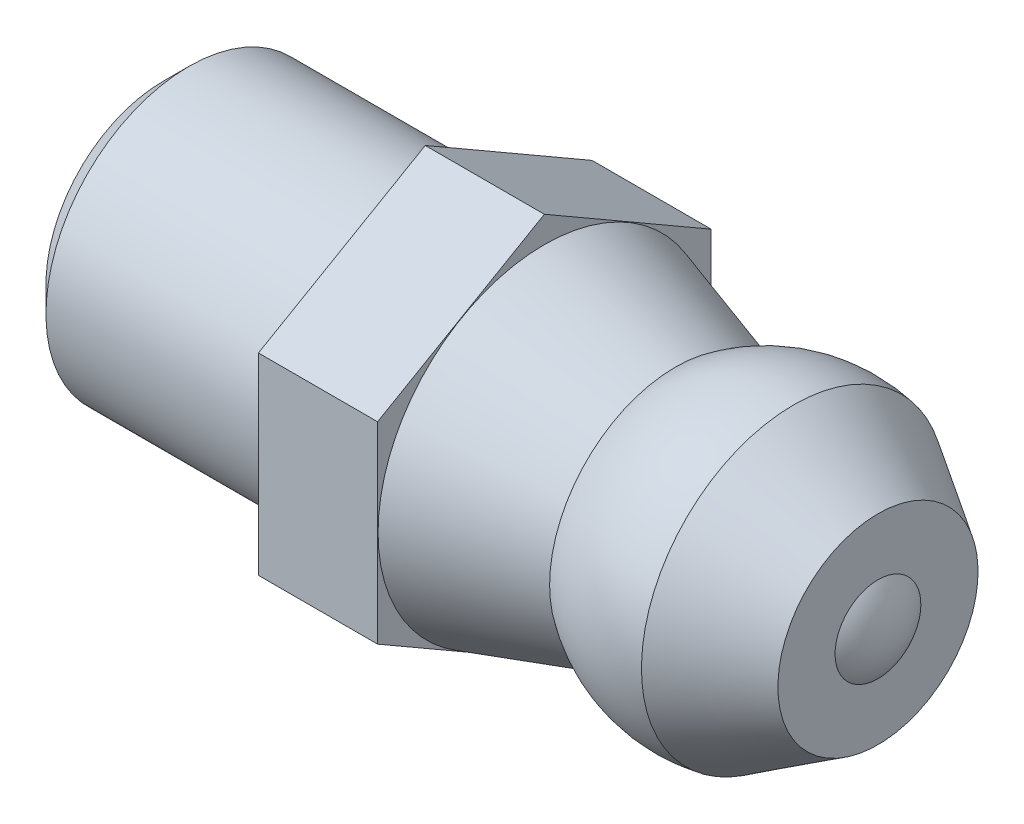
ISO-10303-21;
HEADER;
FILE_DESCRIPTION(('STEP AP214'),'2;1');
FILE_NAME('part.step','',(''),(''),'','','');
FILE_SCHEMA(('AUTOMOTIVE_DESIGN { 1 0 10303 214 1 1 1 1 }'));
ENDSEC;
DATA;
#1=APPLICATION_CONTEXT('core data for automotive mechanical design processes');
#2=APPLICATION_PROTOCOL_DEFINITION('international standard','automotive_design',2000,#1);
#3=PRODUCT_CONTEXT('',#1,'mechanical');
#4=PRODUCT('Part','Part','',(#3));
#5=PRODUCT_RELATED_PRODUCT_CATEGORY('part','',(#4));
#6=PRODUCT_DEFINITION_FORMATION('','',#4);
#7=PRODUCT_DEFINITION_CONTEXT('part definition',#1,'design');
#8=PRODUCT_DEFINITION('design','',#6,#7);
#9=PRODUCT_DEFINITION_SHAPE('','',#8);
#10=(LENGTH_UNIT() NAMED_UNIT(*) SI_UNIT(.MILLI.,.METRE.));
#11=(NAMED_UNIT(*) PLANE_ANGLE_UNIT() SI_UNIT($,.RADIAN.));
#12=(NAMED_UNIT(*) SI_UNIT($,.STERADIAN.) SOLID_ANGLE_UNIT());
#13=UNCERTAINTY_MEASURE_WITH_UNIT(LENGTH_MEASURE(1.E-05),#10,'distance_accuracy_value','');
#14=(GEOMETRIC_REPRESENTATION_CONTEXT(3) GLOBAL_UNCERTAINTY_ASSIGNED_CONTEXT((#13)) GLOBAL_UNIT_ASSIGNED_CONTEXT((#10,
#11,#12)) REPRESENTATION_CONTEXT('',''));
#15=CARTESIAN_POINT('',(0.,0.,0.));
#16=DIRECTION('',(0.,0.,1.));
#17=DIRECTION('',(1.,0.,0.));
#18=AXIS2_PLACEMENT_3D('',#15,#16,#17);
#19=CARTESIAN_POINT('',(8.3,0.,0.));
#20=DIRECTION('',(0.,0.,1.));
#21=DIRECTION('',(1.,0.,0.));
#22=AXIS2_PLACEMENT_3D('',#19,#20,#21);
#23=SPHERICAL_SURFACE('',#22,1.5);
#24=CARTESIAN_POINT('',(8.3,0.,0.));
#25=DIRECTION('',(1.,0.,0.));
#26=DIRECTION('',(0.,1.,0.));
#27=AXIS2_PLACEMENT_3D('',#24,#25,#26);
#28=SPHERICAL_SURFACE('',#27,1.5);
#29=CARTESIAN_POINT('',(9.5,0.,0.));
#30=DIRECTION('',(1.,0.,0.));
#31=DIRECTION('',(0.,1.,0.));
#32=AXIS2_PLACEMENT_3D('',#29,#30,#31);
#33=CIRCLE('',#32,0.9);
#34=CARTESIAN_POINT('',(9.5,0.9,0.));
#35=VERTEX_POINT('',#34);
#36=EDGE_CURVE('E11',#35,#35,#33,.T.);
#37=ORIENTED_EDGE('',*,*,#36,.T.);
#38=EDGE_LOOP('',(#37));
#39=FACE_BOUND('',#38,.T.);
#40=ADVANCED_FACE('F16',(#39),#28,.T.);
#41=CARTESIAN_POINT('',(9.5,1.5,0.));
#42=DIRECTION('',(1.,0.,0.));
#43=DIRECTION('',(0.,1.,0.));
#44=AXIS2_PLACEMENT_3D('',#41,#42,#43);
#45=PLANE('',#44);
#46=CARTESIAN_POINT('',(9.5,0.,0.));
#47=DIRECTION('',(1.,0.,0.));
#48=DIRECTION('',(0.,1.,0.));
#49=AXIS2_PLACEMENT_3D('',#46,#47,#48);
#50=CIRCLE('',#49,2.1);
#51=CARTESIAN_POINT('',(9.5,2.1,0.));
#52=VERTEX_POINT('',#51);
#53=EDGE_CURVE('E26',#52,#52,#50,.T.);
#54=ORIENTED_EDGE('',*,*,#53,.T.);
#55=EDGE_LOOP('',(#54));
#56=FACE_BOUND('',#55,.T.);
#57=ORIENTED_EDGE('',*,*,#36,.F.);
#58=EDGE_LOOP('',(#57));
#59=FACE_BOUND('',#58,.T.);
#60=ADVANCED_FACE('F153',(#56,#59),#45,.T.);
#61=CARTESIAN_POINT('',(8.615744386,0.,0.));
#62=DIRECTION('',(-1.,0.,0.));
#63=DIRECTION('',(0.,1.,0.));
#64=AXIS2_PLACEMENT_3D('',#61,#62,#63);
#65=CONICAL_SURFACE('',#64,2.6470676255,0.554038706826686);
#66=CARTESIAN_POINT('',(7.731488772,0.,0.));
#67=DIRECTION('',(1.,0.,0.));
#68=DIRECTION('',(0.,1.,0.));
#69=AXIS2_PLACEMENT_3D('',#66,#67,#68);
#70=CIRCLE('',#69,3.194135251);
#71=CARTESIAN_POINT('',(7.731488772,3.194135251,0.));
#72=VERTEX_POINT('',#71);
#73=EDGE_CURVE('E95',#72,#72,#70,.T.);
#74=ORIENTED_EDGE('',*,*,#73,.T.);
#75=EDGE_LOOP('',(#74));
#76=FACE_BOUND('',#75,.T.);
#77=ORIENTED_EDGE('',*,*,#53,.F.);
#78=EDGE_LOOP('',(#77));
#79=FACE_BOUND('',#78,.T.);
#80=ADVANCED_FACE('F156',(#76,#79),#65,.T.);
#81=CARTESIAN_POINT('',(7.14260971425139,0.,0.));
#82=DIRECTION('',(1.,0.,0.));
#83=DIRECTION('',(0.,0.,1.));
#84=AXIS2_PLACEMENT_3D('',#81,#82,#83);
#85=DEGENERATE_TOROIDAL_SURFACE('',#84,0.00206897516345217,3.25,.F.);
#86=CARTESIAN_POINT('',(5.25,0.,0.));
#87=DIRECTION('',(1.,0.,0.));
#88=DIRECTION('',(0.,1.,0.));
#89=AXIS2_PLACEMENT_3D('',#86,#87,#88);
#90=CIRCLE('',#89,2.64);
#91=CARTESIAN_POINT('',(5.25,2.64,0.));
#92=VERTEX_POINT('',#91);
#93=EDGE_CURVE('E91',#92,#92,#90,.T.);
#94=ORIENTED_EDGE('',*,*,#93,.T.);
#95=EDGE_LOOP('',(#94));
#96=FACE_BOUND('',#95,.T.);
#97=ORIENTED_EDGE('',*,*,#73,.F.);
#98=EDGE_LOOP('',(#97));
#99=FACE_BOUND('',#98,.T.);
#100=ADVANCED_FACE('F92',(#96,#99),#85,.F.);
#101=CARTESIAN_POINT('',(3.875,0.,0.));
#102=DIRECTION('',(-1.,0.,0.));
#103=DIRECTION('',(0.,1.,0.));
#104=AXIS2_PLACEMENT_3D('',#101,#102,#103);
#105=CONICAL_SURFACE('',#104,3.065,0.29977607009998);
#106=CARTESIAN_POINT('',(2.5,0.,0.));
#107=DIRECTION('',(1.,0.,0.));
#108=DIRECTION('',(0.,1.,0.));
#109=AXIS2_PLACEMENT_3D('',#106,#107,#108);
#110=CIRCLE('',#109,3.49);
#111=CARTESIAN_POINT('',(2.5,3.49,0.));
#112=VERTEX_POINT('',#111);
#113=EDGE_CURVE('E96',#112,#112,#110,.T.);
#114=ORIENTED_EDGE('',*,*,#113,.T.);
#115=EDGE_LOOP('',(#114));
#116=FACE_BOUND('',#115,.T.);
#117=ORIENTED_EDGE('',*,*,#93,.F.);
#118=EDGE_LOOP('',(#117));
#119=FACE_BOUND('',#118,.T.);
#120=ADVANCED_FACE('F164',(#116,#119),#105,.T.);
#121=CARTESIAN_POINT('',(2.5,3.495,0.));
#122=DIRECTION('',(1.,0.,0.));
#123=DIRECTION('',(0.,1.,0.));
#124=AXIS2_PLACEMENT_3D('',#121,#122,#123);
#125=PLANE('',#124);
#126=DIRECTION('',(0.,0.5,-0.866025403784439));
#127=VECTOR('',#126,1.);
#128=CARTESIAN_POINT('',(2.5,4.04145188432738,0.));
#129=LINE('',#128,#127);
#130=CARTESIAN_POINT('',(2.5,2.02072594216369,3.5));
#131=VERTEX_POINT('',#130);
#132=CARTESIAN_POINT('',(2.5,4.04145188432738,0.));
#133=VERTEX_POINT('',#132);
#134=EDGE_CURVE('E102',#131,#133,#129,.T.);
#135=ORIENTED_EDGE('',*,*,#134,.F.);
#136=DIRECTION('',(0.,1.,0.));
#137=VECTOR('',#136,1.);
#138=CARTESIAN_POINT('',(2.5,2.02072594216369,3.5));
#139=LINE('',#138,#137);
#140=CARTESIAN_POINT('',(2.5,-2.02072594216369,3.5));
#141=VERTEX_POINT('',#140);
#142=EDGE_CURVE('E130',#141,#131,#139,.T.);
#143=ORIENTED_EDGE('',*,*,#142,.F.);
#144=DIRECTION('',(0.,0.5,0.866025403784439));
#145=VECTOR('',#144,1.);
#146=CARTESIAN_POINT('',(2.5,-2.02072594216369,3.5));
#147=LINE('',#146,#145);
#148=CARTESIAN_POINT('',(2.5,-4.04145188432738,0.));
#149=VERTEX_POINT('',#148);
#150=EDGE_CURVE('E122',#149,#141,#147,.T.);
#151=ORIENTED_EDGE('',*,*,#150,.F.);
#152=DIRECTION('',(0.,-0.5,0.866025403784439));
#153=VECTOR('',#152,1.);
#154=CARTESIAN_POINT('',(2.5,-4.04145188432738,0.));
#155=LINE('',#154,#153);
#156=CARTESIAN_POINT('',(2.5,-2.02072594216369,-3.5));
#157=VERTEX_POINT('',#156);
#158=EDGE_CURVE('E137',#157,#149,#155,.T.);
#159=ORIENTED_EDGE('',*,*,#158,.F.);
#160=DIRECTION('',(0.,-1.,0.));
#161=VECTOR('',#160,1.);
#162=CARTESIAN_POINT('',(2.5,-2.02072594216369,-3.5));
#163=LINE('',#162,#161);
#164=CARTESIAN_POINT('',(2.5,2.02072594216369,-3.5));
#165=VERTEX_POINT('',#164);
#166=EDGE_CURVE('E106',#165,#157,#163,.T.);
#167=ORIENTED_EDGE('',*,*,#166,.F.);
#168=DIRECTION('',(0.,-0.5,-0.866025403784439));
#169=VECTOR('',#168,1.);
#170=CARTESIAN_POINT('',(2.5,2.02072594216369,-3.5));
#171=LINE('',#170,#169);
#172=EDGE_CURVE('E114',#133,#165,#171,.T.);
#173=ORIENTED_EDGE('',*,*,#172,.F.);
#174=EDGE_LOOP('',(#135,#143,#151,#159,#167,#173));
#175=FACE_BOUND('',#174,.T.);
#176=ORIENTED_EDGE('',*,*,#113,.F.);
#177=EDGE_LOOP('',(#176));
#178=FACE_BOUND('',#177,.T.);
#179=ADVANCED_FACE('F202',(#175,#178),#125,.T.);
#180=CARTESIAN_POINT('',(0.,3.25,0.));
#181=DIRECTION('',(-1.,0.,0.));
#182=DIRECTION('',(0.,-1.,0.));
#183=AXIS2_PLACEMENT_3D('',#180,#181,#182);
#184=PLANE('',#183);
#185=CARTESIAN_POINT('',(0.,0.,0.));
#186=DIRECTION('',(1.,0.,0.));
#187=DIRECTION('',(0.,1.,0.));
#188=AXIS2_PLACEMENT_3D('',#185,#186,#187);
#189=CIRCLE('',#188,3.);
#190=CARTESIAN_POINT('',(0.,3.,0.));
#191=VERTEX_POINT('',#190);
#192=EDGE_CURVE('E43',#191,#191,#189,.T.);
#193=ORIENTED_EDGE('',*,*,#192,.T.);
#194=EDGE_LOOP('',(#193));
#195=FACE_BOUND('',#194,.T.);
#196=DIRECTION('',(0.,-0.5,0.866025403784439));
#197=VECTOR('',#196,1.);
#198=CARTESIAN_POINT('',(0.,4.04145188432738,0.));
#199=LINE('',#198,#197);
#200=CARTESIAN_POINT('',(0.,4.04145188432738,0.));
#201=VERTEX_POINT('',#200);
#202=CARTESIAN_POINT('',(0.,2.02072594216369,3.5));
#203=VERTEX_POINT('',#202);
#204=EDGE_CURVE('E118',#201,#203,#199,.T.);
#205=ORIENTED_EDGE('',*,*,#204,.F.);
#206=DIRECTION('',(0.,0.5,0.866025403784439));
#207=VECTOR('',#206,1.);
#208=CARTESIAN_POINT('',(0.,2.02072594216369,-3.5));
#209=LINE('',#208,#207);
#210=CARTESIAN_POINT('',(0.,2.02072594216369,-3.5));
#211=VERTEX_POINT('',#210);
#212=EDGE_CURVE('E120',#211,#201,#209,.T.);
#213=ORIENTED_EDGE('',*,*,#212,.F.);
#214=DIRECTION('',(0.,1.,0.));
#215=VECTOR('',#214,1.);
#216=CARTESIAN_POINT('',(0.,-2.02072594216369,-3.5));
#217=LINE('',#216,#215);
#218=CARTESIAN_POINT('',(0.,-2.02072594216369,-3.5));
#219=VERTEX_POINT('',#218);
#220=EDGE_CURVE('E110',#219,#211,#217,.T.);
#221=ORIENTED_EDGE('',*,*,#220,.F.);
#222=DIRECTION('',(0.,0.5,-0.866025403784439));
#223=VECTOR('',#222,1.);
#224=CARTESIAN_POINT('',(0.,-4.04145188432738,0.));
#225=LINE('',#224,#223);
#226=CARTESIAN_POINT('',(0.,-4.04145188432738,0.));
#227=VERTEX_POINT('',#226);
#228=EDGE_CURVE('E20',#227,#219,#225,.T.);
#229=ORIENTED_EDGE('',*,*,#228,.F.);
#230=DIRECTION('',(0.,-0.5,-0.866025403784439));
#231=VECTOR('',#230,1.);
#232=CARTESIAN_POINT('',(0.,-2.02072594216369,3.5));
#233=LINE('',#232,#231);
#234=CARTESIAN_POINT('',(0.,-2.02072594216369,3.5));
#235=VERTEX_POINT('',#234);
#236=EDGE_CURVE('E139',#235,#227,#233,.T.);
#237=ORIENTED_EDGE('',*,*,#236,.F.);
#238=DIRECTION('',(0.,-1.,0.));
#239=VECTOR('',#238,1.);
#240=CARTESIAN_POINT('',(0.,2.02072594216369,3.5));
#241=LINE('',#240,#239);
#242=EDGE_CURVE('E131',#203,#235,#241,.T.);
#243=ORIENTED_EDGE('',*,*,#242,.F.);
#244=EDGE_LOOP('',(#205,#213,#221,#229,#237,#243));
#245=FACE_BOUND('',#244,.T.);
#246=ADVANCED_FACE('F18',(#195,#245),#184,.T.);
#247=CARTESIAN_POINT('',(-2.479367,0.,0.));
#248=DIRECTION('',(-1.,0.,0.));
#249=DIRECTION('',(0.,1.,0.));
#250=AXIS2_PLACEMENT_3D('',#247,#248,#249);
#251=CYLINDRICAL_SURFACE('',#250,3.);
#252=CARTESIAN_POINT('',(-4.958734,0.,0.));
#253=DIRECTION('',(1.,0.,0.));
#254=DIRECTION('',(0.,1.,0.));
#255=AXIS2_PLACEMENT_3D('',#252,#253,#254);
#256=CIRCLE('',#255,3.);
#257=CARTESIAN_POINT('',(-4.958734,3.,0.));
#258=VERTEX_POINT('',#257);
#259=EDGE_CURVE('E52',#258,#258,#256,.T.);
#260=ORIENTED_EDGE('',*,*,#259,.T.);
#261=EDGE_LOOP('',(#260));
#262=FACE_BOUND('',#261,.T.);
#263=ORIENTED_EDGE('',*,*,#192,.F.);
#264=EDGE_LOOP('',(#263));
#265=FACE_BOUND('',#264,.T.);
#266=ADVANCED_FACE('F222',(#262,#265),#251,.T.);
#267=CARTESIAN_POINT('',(-5.229367,0.,0.));
#268=DIRECTION('',(1.,0.,0.));
#269=DIRECTION('',(0.,1.,0.));
#270=AXIS2_PLACEMENT_3D('',#267,#268,#269);
#271=CONICAL_SURFACE('',#270,2.729367,0.785398163397448);
#272=CARTESIAN_POINT('',(-5.5,0.,0.));
#273=DIRECTION('',(1.,0.,0.));
#274=DIRECTION('',(0.,1.,0.));
#275=AXIS2_PLACEMENT_3D('',#272,#273,#274);
#276=CIRCLE('',#275,2.458734);
#277=CARTESIAN_POINT('',(-5.5,2.458734,0.));
#278=VERTEX_POINT('',#277);
#279=EDGE_CURVE('E105',#278,#278,#276,.T.);
#280=ORIENTED_EDGE('',*,*,#279,.T.);
#281=EDGE_LOOP('',(#280));
#282=FACE_BOUND('',#281,.T.);
#283=ORIENTED_EDGE('',*,*,#259,.F.);
#284=EDGE_LOOP('',(#283));
#285=FACE_BOUND('',#284,.T.);
#286=ADVANCED_FACE('F214',(#282,#285),#271,.T.);
#287=CARTESIAN_POINT('',(-5.5,1.229367,0.));
#288=DIRECTION('',(-1.,0.,0.));
#289=DIRECTION('',(0.,-1.,0.));
#290=AXIS2_PLACEMENT_3D('',#287,#288,#289);
#291=PLANE('',#290);
#292=ORIENTED_EDGE('',*,*,#279,.F.);
#293=EDGE_LOOP('',(#292));
#294=FACE_BOUND('',#293,.T.);
#295=ADVANCED_FACE('F209',(#294),#291,.T.);
#296=CARTESIAN_POINT('',(0.,-3.03108891324554,-1.75));
#297=DIRECTION('',(0.,-0.866025403784439,-0.5));
#298=DIRECTION('',(0.,0.5,-0.866025403784439));
#299=AXIS2_PLACEMENT_3D('',#296,#297,#298);
#300=PLANE('',#299);
#301=ORIENTED_EDGE('',*,*,#228,.T.);
#302=DIRECTION('',(1.,0.,0.));
#303=VECTOR('',#302,1.);
#304=CARTESIAN_POINT('',(0.,-2.02072594216369,-3.5));
#305=LINE('',#304,#303);
#306=EDGE_CURVE('E109',#219,#157,#305,.T.);
#307=ORIENTED_EDGE('',*,*,#306,.T.);
#308=ORIENTED_EDGE('',*,*,#158,.T.);
#309=DIRECTION('',(1.,0.,0.));
#310=VECTOR('',#309,1.);
#311=CARTESIAN_POINT('',(0.,-4.04145188432738,0.));
#312=LINE('',#311,#310);
#313=EDGE_CURVE('E141',#227,#149,#312,.T.);
#314=ORIENTED_EDGE('',*,*,#313,.F.);
#315=EDGE_LOOP('',(#301,#307,#308,#314));
#316=FACE_BOUND('',#315,.T.);
#317=ADVANCED_FACE('F184',(#316),#300,.T.);
#318=CARTESIAN_POINT('',(0.,0.,-3.5));
#319=DIRECTION('',(0.,0.,-1.));
#320=DIRECTION('',(0.,1.,0.));
#321=AXIS2_PLACEMENT_3D('',#318,#319,#320);
#322=PLANE('',#321);
#323=ORIENTED_EDGE('',*,*,#220,.T.);
#324=DIRECTION('',(1.,0.,0.));
#325=VECTOR('',#324,1.);
#326=CARTESIAN_POINT('',(0.,2.02072594216369,-3.5));
#327=LINE('',#326,#325);
#328=EDGE_CURVE('E111',#211,#165,#327,.T.);
#329=ORIENTED_EDGE('',*,*,#328,.T.);
#330=ORIENTED_EDGE('',*,*,#166,.T.);
#331=ORIENTED_EDGE('',*,*,#306,.F.);
#332=EDGE_LOOP('',(#323,#329,#330,#331));
#333=FACE_BOUND('',#332,.T.);
#334=ADVANCED_FACE('F176',(#333),#322,.T.);
#335=CARTESIAN_POINT('',(0.,3.03108891324554,-1.75));
#336=DIRECTION('',(0.,0.866025403784439,-0.5));
#337=DIRECTION('',(0.,0.5,0.866025403784439));
#338=AXIS2_PLACEMENT_3D('',#335,#336,#337);
#339=PLANE('',#338);
#340=ORIENTED_EDGE('',*,*,#212,.T.);
#341=DIRECTION('',(1.,0.,0.));
#342=VECTOR('',#341,1.);
#343=CARTESIAN_POINT('',(0.,4.04145188432738,0.));
#344=LINE('',#343,#342);
#345=EDGE_CURVE('E132',#201,#133,#344,.T.);
#346=ORIENTED_EDGE('',*,*,#345,.T.);
#347=ORIENTED_EDGE('',*,*,#172,.T.);
#348=ORIENTED_EDGE('',*,*,#328,.F.);
#349=EDGE_LOOP('',(#340,#346,#347,#348));
#350=FACE_BOUND('',#349,.T.);
#351=ADVANCED_FACE('F173',(#350),#339,.T.);
#352=CARTESIAN_POINT('',(0.,-3.03108891324554,1.75));
#353=DIRECTION('',(0.,-0.866025403784439,0.5));
#354=DIRECTION('',(0.,-0.5,-0.866025403784439));
#355=AXIS2_PLACEMENT_3D('',#352,#353,#354);
#356=PLANE('',#355);
#357=ORIENTED_EDGE('',*,*,#236,.T.);
#358=ORIENTED_EDGE('',*,*,#313,.T.);
#359=ORIENTED_EDGE('',*,*,#150,.T.);
#360=DIRECTION('',(1.,0.,0.));
#361=VECTOR('',#360,1.);
#362=CARTESIAN_POINT('',(0.,-2.02072594216369,3.5));
#363=LINE('',#362,#361);
#364=EDGE_CURVE('E127',#235,#141,#363,.T.);
#365=ORIENTED_EDGE('',*,*,#364,.F.);
#366=EDGE_LOOP('',(#357,#358,#359,#365));
#367=FACE_BOUND('',#366,.T.);
#368=ADVANCED_FACE('F175',(#367),#356,.T.);
#369=CARTESIAN_POINT('',(0.,0.,3.5));
#370=DIRECTION('',(0.,0.,1.));
#371=DIRECTION('',(0.,-1.,0.));
#372=AXIS2_PLACEMENT_3D('',#369,#370,#371);
#373=PLANE('',#372);
#374=ORIENTED_EDGE('',*,*,#242,.T.);
#375=ORIENTED_EDGE('',*,*,#364,.T.);
#376=ORIENTED_EDGE('',*,*,#142,.T.);
#377=DIRECTION('',(1.,0.,0.));
#378=VECTOR('',#377,1.);
#379=CARTESIAN_POINT('',(0.,2.02072594216369,3.5));
#380=LINE('',#379,#378);
#381=EDGE_CURVE('E115',#203,#131,#380,.T.);
#382=ORIENTED_EDGE('',*,*,#381,.F.);
#383=EDGE_LOOP('',(#374,#375,#376,#382));
#384=FACE_BOUND('',#383,.T.);
#385=ADVANCED_FACE('F182',(#384),#373,.T.);
#386=CARTESIAN_POINT('',(0.,3.03108891324554,1.75));
#387=DIRECTION('',(0.,0.866025403784439,0.5));
#388=DIRECTION('',(0.,-0.5,0.866025403784439));
#389=AXIS2_PLACEMENT_3D('',#386,#387,#388);
#390=PLANE('',#389);
#391=ORIENTED_EDGE('',*,*,#204,.T.);
#392=ORIENTED_EDGE('',*,*,#381,.T.);
#393=ORIENTED_EDGE('',*,*,#134,.T.);
#394=ORIENTED_EDGE('',*,*,#345,.F.);
#395=EDGE_LOOP('',(#391,#392,#393,#394));
#396=FACE_BOUND('',#395,.T.);
#397=ADVANCED_FACE('F195',(#396),#390,.T.);
#398=CLOSED_SHELL('',(#40,#60,#80,#100,#120,#179,#246,#266,#286,#295,#317,#334,#351,#368,#385,#397));
#399=MANIFOLD_SOLID_BREP('B1',#398);
#400=ADVANCED_BREP_SHAPE_REPRESENTATION('',(#18,#399),#14);
#401=SHAPE_DEFINITION_REPRESENTATION(#9,#400);
ENDSEC;
END-ISO-10303-21;
